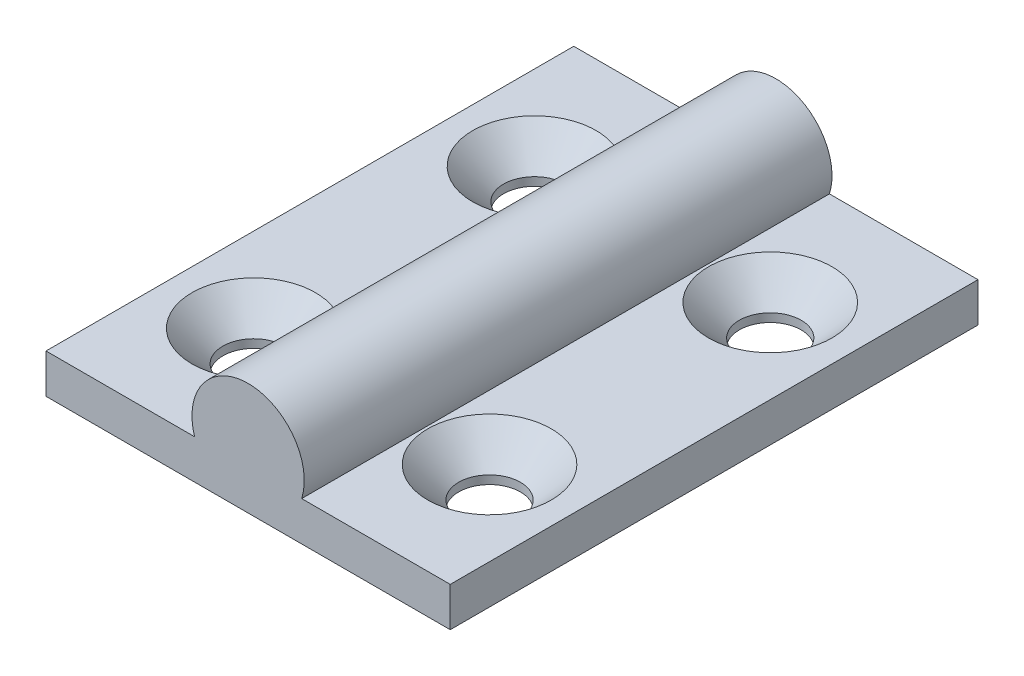
ISO-10303-21;
HEADER;
FILE_DESCRIPTION(('STEP AP214'),'2;1');
FILE_NAME('part.step','',(''),(''),'','','');
FILE_SCHEMA(('AUTOMOTIVE_DESIGN { 1 0 10303 214 1 1 1 1 }'));
ENDSEC;
DATA;
#1=APPLICATION_CONTEXT('core data for automotive mechanical design processes');
#2=APPLICATION_PROTOCOL_DEFINITION('international standard','automotive_design',2000,#1);
#3=PRODUCT_CONTEXT('',#1,'mechanical');
#4=PRODUCT('Part','Part','',(#3));
#5=PRODUCT_RELATED_PRODUCT_CATEGORY('part','',(#4));
#6=PRODUCT_DEFINITION_FORMATION('','',#4);
#7=PRODUCT_DEFINITION_CONTEXT('part definition',#1,'design');
#8=PRODUCT_DEFINITION('design','',#6,#7);
#9=PRODUCT_DEFINITION_SHAPE('','',#8);
#10=(LENGTH_UNIT() NAMED_UNIT(*) SI_UNIT(.MILLI.,.METRE.));
#11=(NAMED_UNIT(*) PLANE_ANGLE_UNIT() SI_UNIT($,.RADIAN.));
#12=(NAMED_UNIT(*) SI_UNIT($,.STERADIAN.) SOLID_ANGLE_UNIT());
#13=UNCERTAINTY_MEASURE_WITH_UNIT(LENGTH_MEASURE(1.E-05),#10,'distance_accuracy_value','');
#14=(GEOMETRIC_REPRESENTATION_CONTEXT(3) GLOBAL_UNCERTAINTY_ASSIGNED_CONTEXT((#13)) GLOBAL_UNIT_ASSIGNED_CONTEXT((#10,
#11,#12)) REPRESENTATION_CONTEXT('',''));
#15=CARTESIAN_POINT('',(0.,0.,0.));
#16=DIRECTION('',(0.,0.,1.));
#17=DIRECTION('',(1.,0.,0.));
#18=AXIS2_PLACEMENT_3D('',#15,#16,#17);
#19=CARTESIAN_POINT('',(0.,1.66533453693773E-13,23.5));
#20=DIRECTION('',(0.,0.,-1.));
#21=DIRECTION('',(-1.,0.,0.));
#22=AXIS2_PLACEMENT_3D('',#19,#20,#21);
#23=CYLINDRICAL_SURFACE('',#22,5.);
#24=DIRECTION('',(0.,0.,-1.));
#25=VECTOR('',#24,1.);
#26=CARTESIAN_POINT('',(4.76969600708477,-1.49999999999989,23.5000000000001));
#27=LINE('',#26,#25);
#28=CARTESIAN_POINT('',(4.76969600708477,-1.49999999999989,23.5000000000001));
#29=VERTEX_POINT('',#28);
#30=CARTESIAN_POINT('',(4.76969600708472,-1.5,-23.4999999999999));
#31=VERTEX_POINT('',#30);
#32=EDGE_CURVE('E121',#29,#31,#27,.T.);
#33=ORIENTED_EDGE('',*,*,#32,.T.);
#34=CARTESIAN_POINT('',(0.,0.,-23.5));
#35=DIRECTION('',(0.,0.,1.));
#36=DIRECTION('',(1.,0.,0.));
#37=AXIS2_PLACEMENT_3D('',#34,#35,#36);
#38=CIRCLE('',#37,5.);
#39=CARTESIAN_POINT('',(-4.76969600708477,-1.50000000000006,-23.5));
#40=VERTEX_POINT('',#39);
#41=EDGE_CURVE('E145',#31,#40,#38,.T.);
#42=ORIENTED_EDGE('',*,*,#41,.T.);
#43=DIRECTION('',(0.,0.,-1.));
#44=VECTOR('',#43,1.);
#45=CARTESIAN_POINT('',(-4.76969600708472,-1.49999999999989,23.5000000000001));
#46=LINE('',#45,#44);
#47=CARTESIAN_POINT('',(-4.76969600708472,-1.49999999999989,23.5000000000001));
#48=VERTEX_POINT('',#47);
#49=EDGE_CURVE('E11',#48,#40,#46,.T.);
#50=ORIENTED_EDGE('',*,*,#49,.F.);
#51=CARTESIAN_POINT('',(0.,1.66533453693773E-13,23.5));
#52=DIRECTION('',(0.,0.,1.));
#53=DIRECTION('',(1.,0.,0.));
#54=AXIS2_PLACEMENT_3D('',#51,#52,#53);
#55=CIRCLE('',#54,5.);
#56=EDGE_CURVE('E53',#29,#48,#55,.T.);
#57=ORIENTED_EDGE('',*,*,#56,.F.);
#58=EDGE_LOOP('',(#33,#42,#50,#57));
#59=FACE_BOUND('',#58,.T.);
#60=ADVANCED_FACE('F38',(#59),#23,.T.);
#61=CARTESIAN_POINT('',(0.,-4.99999999999984,23.5000000000004));
#62=DIRECTION('',(0.,-1.,0.));
#63=DIRECTION('',(1.,0.,0.));
#64=AXIS2_PLACEMENT_3D('',#61,#62,#63);
#65=PLANE('',#64);
#66=CARTESIAN_POINT('',(10.5,-5.,-12.4999999999995));
#67=DIRECTION('',(0.,1.,0.));
#68=DIRECTION('',(0.,0.,1.));
#69=AXIS2_PLACEMENT_3D('',#66,#67,#68);
#70=CIRCLE('',#69,2.75);
#71=CARTESIAN_POINT('',(10.5,-5.,-9.74999999999951));
#72=VERTEX_POINT('',#71);
#73=EDGE_CURVE('E272',#72,#72,#70,.T.);
#74=ORIENTED_EDGE('',*,*,#73,.T.);
#75=EDGE_LOOP('',(#74));
#76=FACE_BOUND('',#75,.T.);
#77=CARTESIAN_POINT('',(10.5,-5.,12.5000000000005));
#78=DIRECTION('',(0.,1.,0.));
#79=DIRECTION('',(0.,0.,1.));
#80=AXIS2_PLACEMENT_3D('',#77,#78,#79);
#81=CIRCLE('',#80,2.75);
#82=CARTESIAN_POINT('',(10.5,-5.,15.2500000000005));
#83=VERTEX_POINT('',#82);
#84=EDGE_CURVE('E161',#83,#83,#81,.T.);
#85=ORIENTED_EDGE('',*,*,#84,.T.);
#86=EDGE_LOOP('',(#85));
#87=FACE_BOUND('',#86,.T.);
#88=CARTESIAN_POINT('',(-10.5,-5.00000000000006,-12.4999999999996));
#89=DIRECTION('',(0.,1.,0.));
#90=DIRECTION('',(0.,0.,1.));
#91=AXIS2_PLACEMENT_3D('',#88,#89,#90);
#92=CIRCLE('',#91,2.75);
#93=CARTESIAN_POINT('',(-10.5,-5.00000000000006,-9.74999999999962));
#94=VERTEX_POINT('',#93);
#95=EDGE_CURVE('E127',#94,#94,#92,.T.);
#96=ORIENTED_EDGE('',*,*,#95,.T.);
#97=EDGE_LOOP('',(#96));
#98=FACE_BOUND('',#97,.T.);
#99=CARTESIAN_POINT('',(-10.5,-5.00000000000006,12.5000000000004));
#100=DIRECTION('',(0.,1.,0.));
#101=DIRECTION('',(0.,0.,1.));
#102=AXIS2_PLACEMENT_3D('',#99,#100,#101);
#103=CIRCLE('',#102,2.75);
#104=CARTESIAN_POINT('',(-10.5,-5.00000000000006,15.2500000000004));
#105=VERTEX_POINT('',#104);
#106=EDGE_CURVE('E136',#105,#105,#103,.T.);
#107=ORIENTED_EDGE('',*,*,#106,.T.);
#108=EDGE_LOOP('',(#107));
#109=FACE_BOUND('',#108,.T.);
#110=DIRECTION('',(-1.,0.,0.));
#111=VECTOR('',#110,1.);
#112=CARTESIAN_POINT('',(0.,-5.,-23.4999999999995));
#113=LINE('',#112,#111);
#114=CARTESIAN_POINT('',(18.,-5.,-23.5000000000002));
#115=VERTEX_POINT('',#114);
#116=CARTESIAN_POINT('',(-18.,-4.99999999999995,-23.4999999999995));
#117=VERTEX_POINT('',#116);
#118=EDGE_CURVE('E114',#115,#117,#113,.T.);
#119=ORIENTED_EDGE('',*,*,#118,.F.);
#120=DIRECTION('',(0.,0.,-1.));
#121=VECTOR('',#120,1.);
#122=CARTESIAN_POINT('',(18.,-5.,23.4999999999999));
#123=LINE('',#122,#121);
#124=CARTESIAN_POINT('',(18.,-5.,23.4999999999999));
#125=VERTEX_POINT('',#124);
#126=EDGE_CURVE('E107',#125,#115,#123,.T.);
#127=ORIENTED_EDGE('',*,*,#126,.F.);
#128=DIRECTION('',(-1.,0.,0.));
#129=VECTOR('',#128,1.);
#130=CARTESIAN_POINT('',(0.,-4.99999999999984,23.5000000000004));
#131=LINE('',#130,#129);
#132=CARTESIAN_POINT('',(-18.,-4.99999999999989,23.5000000000005));
#133=VERTEX_POINT('',#132);
#134=EDGE_CURVE('E95',#125,#133,#131,.T.);
#135=ORIENTED_EDGE('',*,*,#134,.T.);
#136=DIRECTION('',(0.,0.,-1.));
#137=VECTOR('',#136,1.);
#138=CARTESIAN_POINT('',(-18.,-4.99999999999989,23.5000000000005));
#139=LINE('',#138,#137);
#140=EDGE_CURVE('E62',#133,#117,#139,.T.);
#141=ORIENTED_EDGE('',*,*,#140,.T.);
#142=EDGE_LOOP('',(#119,#127,#135,#141));
#143=FACE_BOUND('',#142,.T.);
#144=ADVANCED_FACE('F40',(#76,#87,#98,#109,#143),#65,.T.);
#145=CARTESIAN_POINT('',(0.,-1.49999999999983,23.5000000000001));
#146=DIRECTION('',(0.,1.,0.));
#147=DIRECTION('',(0.,0.,1.));
#148=AXIS2_PLACEMENT_3D('',#145,#146,#147);
#149=PLANE('',#148);
#150=CARTESIAN_POINT('',(-10.5,-1.50000000000006,-12.4999999999996));
#151=DIRECTION('',(0.,1.,0.));
#152=DIRECTION('',(0.,0.,1.));
#153=AXIS2_PLACEMENT_3D('',#150,#151,#152);
#154=CIRCLE('',#153,5.5);
#155=CARTESIAN_POINT('',(-10.5,-1.50000000000006,-6.99999999999962));
#156=VERTEX_POINT('',#155);
#157=EDGE_CURVE('E116',#156,#156,#154,.T.);
#158=ORIENTED_EDGE('',*,*,#157,.F.);
#159=EDGE_LOOP('',(#158));
#160=FACE_BOUND('',#159,.T.);
#161=CARTESIAN_POINT('',(-10.5000000000001,-1.50000000000006,12.5000000000004));
#162=DIRECTION('',(0.,1.,0.));
#163=DIRECTION('',(0.,0.,1.));
#164=AXIS2_PLACEMENT_3D('',#161,#162,#163);
#165=CIRCLE('',#164,5.5);
#166=CARTESIAN_POINT('',(-10.5000000000001,-1.50000000000006,18.0000000000004));
#167=VERTEX_POINT('',#166);
#168=EDGE_CURVE('E130',#167,#167,#165,.T.);
#169=ORIENTED_EDGE('',*,*,#168,.F.);
#170=EDGE_LOOP('',(#169));
#171=FACE_BOUND('',#170,.T.);
#172=DIRECTION('',(1.,0.,0.));
#173=VECTOR('',#172,1.);
#174=CARTESIAN_POINT('',(0.,-1.5,-23.4999999999999));
#175=LINE('',#174,#173);
#176=CARTESIAN_POINT('',(-18.,-1.49999999999995,-23.4999999999999));
#177=VERTEX_POINT('',#176);
#178=EDGE_CURVE('E147',#177,#40,#175,.T.);
#179=ORIENTED_EDGE('',*,*,#178,.F.);
#180=DIRECTION('',(0.,0.,-1.));
#181=VECTOR('',#180,1.);
#182=CARTESIAN_POINT('',(-18.,-1.49999999999989,23.5000000000002));
#183=LINE('',#182,#181);
#184=CARTESIAN_POINT('',(-18.,-1.49999999999989,23.5000000000002));
#185=VERTEX_POINT('',#184);
#186=EDGE_CURVE('E46',#185,#177,#183,.T.);
#187=ORIENTED_EDGE('',*,*,#186,.F.);
#188=DIRECTION('',(1.,0.,0.));
#189=VECTOR('',#188,1.);
#190=CARTESIAN_POINT('',(0.,-1.49999999999983,23.5000000000001));
#191=LINE('',#190,#189);
#192=EDGE_CURVE('E140',#185,#48,#191,.T.);
#193=ORIENTED_EDGE('',*,*,#192,.T.);
#194=ORIENTED_EDGE('',*,*,#49,.T.);
#195=EDGE_LOOP('',(#179,#187,#193,#194));
#196=FACE_BOUND('',#195,.T.);
#197=ADVANCED_FACE('F155',(#160,#171,#196),#149,.T.);
#198=CARTESIAN_POINT('',(-18.,1.11022302462516E-13,23.5000000000001));
#199=DIRECTION('',(-1.,0.,0.));
#200=DIRECTION('',(0.,0.,1.));
#201=AXIS2_PLACEMENT_3D('',#198,#199,#200);
#202=PLANE('',#201);
#203=DIRECTION('',(0.,1.,0.));
#204=VECTOR('',#203,1.);
#205=CARTESIAN_POINT('',(-18.,0.,-23.5));
#206=LINE('',#205,#204);
#207=EDGE_CURVE('E102',#117,#177,#206,.T.);
#208=ORIENTED_EDGE('',*,*,#207,.F.);
#209=ORIENTED_EDGE('',*,*,#140,.F.);
#210=DIRECTION('',(0.,1.,0.));
#211=VECTOR('',#210,1.);
#212=CARTESIAN_POINT('',(-18.,1.11022302462516E-13,23.5000000000001));
#213=LINE('',#212,#211);
#214=EDGE_CURVE('E100',#133,#185,#213,.T.);
#215=ORIENTED_EDGE('',*,*,#214,.T.);
#216=ORIENTED_EDGE('',*,*,#186,.T.);
#217=EDGE_LOOP('',(#208,#209,#215,#216));
#218=FACE_BOUND('',#217,.T.);
#219=ADVANCED_FACE('F153',(#218),#202,.T.);
#220=CARTESIAN_POINT('',(0.,1.66533453693773E-13,23.5));
#221=DIRECTION('',(0.,0.,1.));
#222=DIRECTION('',(1.,0.,0.));
#223=AXIS2_PLACEMENT_3D('',#220,#221,#222);
#224=PLANE('',#223);
#225=ORIENTED_EDGE('',*,*,#134,.F.);
#226=DIRECTION('',(0.,1.,0.));
#227=VECTOR('',#226,1.);
#228=CARTESIAN_POINT('',(18.0000000000001,0.,23.5000000000003));
#229=LINE('',#228,#227);
#230=CARTESIAN_POINT('',(18.,-1.5,23.4999999999999));
#231=VERTEX_POINT('',#230);
#232=EDGE_CURVE('E98',#125,#231,#229,.T.);
#233=ORIENTED_EDGE('',*,*,#232,.T.);
#234=DIRECTION('',(-1.,0.,0.));
#235=VECTOR('',#234,1.);
#236=CARTESIAN_POINT('',(0.,-1.49999999999983,23.5000000000001));
#237=LINE('',#236,#235);
#238=EDGE_CURVE('E111',#231,#29,#237,.T.);
#239=ORIENTED_EDGE('',*,*,#238,.T.);
#240=ORIENTED_EDGE('',*,*,#56,.T.);
#241=ORIENTED_EDGE('',*,*,#192,.F.);
#242=ORIENTED_EDGE('',*,*,#214,.F.);
#243=EDGE_LOOP('',(#225,#233,#239,#240,#241,#242));
#244=FACE_BOUND('',#243,.T.);
#245=ADVANCED_FACE('F97',(#244),#224,.T.);
#246=CARTESIAN_POINT('',(0.,0.,-23.5));
#247=DIRECTION('',(0.,0.,1.));
#248=DIRECTION('',(1.,0.,0.));
#249=AXIS2_PLACEMENT_3D('',#246,#247,#248);
#250=PLANE('',#249);
#251=ORIENTED_EDGE('',*,*,#178,.T.);
#252=ORIENTED_EDGE('',*,*,#41,.F.);
#253=DIRECTION('',(-1.,0.,0.));
#254=VECTOR('',#253,1.);
#255=CARTESIAN_POINT('',(0.,-1.5,-23.4999999999999));
#256=LINE('',#255,#254);
#257=CARTESIAN_POINT('',(18.,-1.5,-23.5000000000001));
#258=VERTEX_POINT('',#257);
#259=EDGE_CURVE('E112',#258,#31,#256,.T.);
#260=ORIENTED_EDGE('',*,*,#259,.F.);
#261=DIRECTION('',(0.,1.,0.));
#262=VECTOR('',#261,1.);
#263=CARTESIAN_POINT('',(18.,0.,-23.4999999999997));
#264=LINE('',#263,#262);
#265=EDGE_CURVE('E159',#115,#258,#264,.T.);
#266=ORIENTED_EDGE('',*,*,#265,.F.);
#267=ORIENTED_EDGE('',*,*,#118,.T.);
#268=ORIENTED_EDGE('',*,*,#207,.T.);
#269=EDGE_LOOP('',(#251,#252,#260,#266,#267,#268));
#270=FACE_BOUND('',#269,.T.);
#271=ADVANCED_FACE('F157',(#270),#250,.F.);
#272=CARTESIAN_POINT('',(-10.5000000000001,-1.50000000000006,12.5000000000004));
#273=DIRECTION('',(0.,1.,0.));
#274=DIRECTION('',(0.,0.,1.));
#275=AXIS2_PLACEMENT_3D('',#272,#273,#274);
#276=CYLINDRICAL_SURFACE('',#275,2.75);
#277=ORIENTED_EDGE('',*,*,#106,.F.);
#278=EDGE_LOOP('',(#277));
#279=FACE_BOUND('',#278,.T.);
#280=CARTESIAN_POINT('',(-10.5000000000001,-4.25000000000003,12.5000000000004));
#281=DIRECTION('',(0.,1.,0.));
#282=DIRECTION('',(0.,0.,1.));
#283=AXIS2_PLACEMENT_3D('',#280,#281,#282);
#284=CIRCLE('',#283,2.75);
#285=CARTESIAN_POINT('',(-10.5000000000001,-4.25000000000003,15.2500000000004));
#286=VERTEX_POINT('',#285);
#287=EDGE_CURVE('E133',#286,#286,#284,.T.);
#288=ORIENTED_EDGE('',*,*,#287,.T.);
#289=EDGE_LOOP('',(#288));
#290=FACE_BOUND('',#289,.T.);
#291=ADVANCED_FACE('F199',(#279,#290),#276,.F.);
#292=CARTESIAN_POINT('',(-10.5000000000001,-1.50000000000006,12.5000000000004));
#293=DIRECTION('',(0.,1.,0.));
#294=DIRECTION('',(0.,0.,1.));
#295=AXIS2_PLACEMENT_3D('',#292,#293,#294);
#296=CONICAL_SURFACE('',#295,5.5,0.78539816339745);
#297=ORIENTED_EDGE('',*,*,#287,.F.);
#298=EDGE_LOOP('',(#297));
#299=FACE_BOUND('',#298,.T.);
#300=ORIENTED_EDGE('',*,*,#168,.T.);
#301=EDGE_LOOP('',(#300));
#302=FACE_BOUND('',#301,.T.);
#303=ADVANCED_FACE('F204',(#299,#302),#296,.F.);
#304=CARTESIAN_POINT('',(-10.5,-1.50000000000006,-12.4999999999996));
#305=DIRECTION('',(0.,1.,0.));
#306=DIRECTION('',(0.,0.,1.));
#307=AXIS2_PLACEMENT_3D('',#304,#305,#306);
#308=CYLINDRICAL_SURFACE('',#307,2.75);
#309=ORIENTED_EDGE('',*,*,#95,.F.);
#310=EDGE_LOOP('',(#309));
#311=FACE_BOUND('',#310,.T.);
#312=CARTESIAN_POINT('',(-10.5,-4.25000000000003,-12.4999999999996));
#313=DIRECTION('',(0.,1.,0.));
#314=DIRECTION('',(0.,0.,1.));
#315=AXIS2_PLACEMENT_3D('',#312,#313,#314);
#316=CIRCLE('',#315,2.75);
#317=CARTESIAN_POINT('',(-10.5,-4.25000000000003,-9.74999999999962));
#318=VERTEX_POINT('',#317);
#319=EDGE_CURVE('E119',#318,#318,#316,.T.);
#320=ORIENTED_EDGE('',*,*,#319,.T.);
#321=EDGE_LOOP('',(#320));
#322=FACE_BOUND('',#321,.T.);
#323=ADVANCED_FACE('F208',(#311,#322),#308,.F.);
#324=CARTESIAN_POINT('',(-10.5,-1.50000000000006,-12.4999999999996));
#325=DIRECTION('',(0.,1.,0.));
#326=DIRECTION('',(0.,0.,1.));
#327=AXIS2_PLACEMENT_3D('',#324,#325,#326);
#328=CONICAL_SURFACE('',#327,5.5,0.78539816339745);
#329=ORIENTED_EDGE('',*,*,#319,.F.);
#330=EDGE_LOOP('',(#329));
#331=FACE_BOUND('',#330,.T.);
#332=ORIENTED_EDGE('',*,*,#157,.T.);
#333=EDGE_LOOP('',(#332));
#334=FACE_BOUND('',#333,.T.);
#335=ADVANCED_FACE('F182',(#331,#334),#328,.F.);
#336=CARTESIAN_POINT('',(18.0000000000001,0.,23.5000000000003));
#337=DIRECTION('',(-1.,0.,0.));
#338=DIRECTION('',(0.,0.,1.));
#339=AXIS2_PLACEMENT_3D('',#336,#337,#338);
#340=PLANE('',#339);
#341=ORIENTED_EDGE('',*,*,#265,.T.);
#342=DIRECTION('',(0.,0.,-1.));
#343=VECTOR('',#342,1.);
#344=CARTESIAN_POINT('',(18.,-1.5,23.4999999999999));
#345=LINE('',#344,#343);
#346=EDGE_CURVE('E109',#231,#258,#345,.T.);
#347=ORIENTED_EDGE('',*,*,#346,.F.);
#348=ORIENTED_EDGE('',*,*,#232,.F.);
#349=ORIENTED_EDGE('',*,*,#126,.T.);
#350=EDGE_LOOP('',(#341,#347,#348,#349));
#351=FACE_BOUND('',#350,.T.);
#352=ADVANCED_FACE('F106',(#351),#340,.F.);
#353=CARTESIAN_POINT('',(0.,-1.49999999999983,23.5000000000001));
#354=DIRECTION('',(0.,-1.,0.));
#355=DIRECTION('',(0.,0.,-1.));
#356=AXIS2_PLACEMENT_3D('',#353,#354,#355);
#357=PLANE('',#356);
#358=CARTESIAN_POINT('',(10.5,-1.5,-12.4999999999998));
#359=DIRECTION('',(0.,1.,0.));
#360=DIRECTION('',(0.,0.,1.));
#361=AXIS2_PLACEMENT_3D('',#358,#359,#360);
#362=CIRCLE('',#361,5.5);
#363=CARTESIAN_POINT('',(10.5,-1.5,-6.99999999999984));
#364=VERTEX_POINT('',#363);
#365=EDGE_CURVE('E270',#364,#364,#362,.T.);
#366=ORIENTED_EDGE('',*,*,#365,.F.);
#367=EDGE_LOOP('',(#366));
#368=FACE_BOUND('',#367,.T.);
#369=CARTESIAN_POINT('',(10.5,-1.5,12.5000000000002));
#370=DIRECTION('',(0.,1.,0.));
#371=DIRECTION('',(0.,0.,1.));
#372=AXIS2_PLACEMENT_3D('',#369,#370,#371);
#373=CIRCLE('',#372,5.5);
#374=CARTESIAN_POINT('',(10.5,-1.5,18.0000000000002));
#375=VERTEX_POINT('',#374);
#376=EDGE_CURVE('E277',#375,#375,#373,.T.);
#377=ORIENTED_EDGE('',*,*,#376,.F.);
#378=EDGE_LOOP('',(#377));
#379=FACE_BOUND('',#378,.T.);
#380=ORIENTED_EDGE('',*,*,#259,.T.);
#381=ORIENTED_EDGE('',*,*,#32,.F.);
#382=ORIENTED_EDGE('',*,*,#238,.F.);
#383=ORIENTED_EDGE('',*,*,#346,.T.);
#384=EDGE_LOOP('',(#380,#381,#382,#383));
#385=FACE_BOUND('',#384,.T.);
#386=ADVANCED_FACE('F170',(#368,#379,#385),#357,.F.);
#387=CARTESIAN_POINT('',(10.5,-1.5,12.5000000000002));
#388=DIRECTION('',(0.,1.,0.));
#389=DIRECTION('',(0.,0.,1.));
#390=AXIS2_PLACEMENT_3D('',#387,#388,#389);
#391=CYLINDRICAL_SURFACE('',#390,2.75);
#392=ORIENTED_EDGE('',*,*,#84,.F.);
#393=EDGE_LOOP('',(#392));
#394=FACE_BOUND('',#393,.T.);
#395=CARTESIAN_POINT('',(10.5,-4.25000000000003,12.5000000000005));
#396=DIRECTION('',(0.,1.,0.));
#397=DIRECTION('',(0.,0.,1.));
#398=AXIS2_PLACEMENT_3D('',#395,#396,#397);
#399=CIRCLE('',#398,2.75);
#400=CARTESIAN_POINT('',(10.5,-4.25000000000003,15.2500000000005));
#401=VERTEX_POINT('',#400);
#402=EDGE_CURVE('E165',#401,#401,#399,.T.);
#403=ORIENTED_EDGE('',*,*,#402,.T.);
#404=EDGE_LOOP('',(#403));
#405=FACE_BOUND('',#404,.T.);
#406=ADVANCED_FACE('F172',(#394,#405),#391,.F.);
#407=CARTESIAN_POINT('',(10.5,-1.5,12.5000000000002));
#408=DIRECTION('',(0.,1.,0.));
#409=DIRECTION('',(0.,0.,1.));
#410=AXIS2_PLACEMENT_3D('',#407,#408,#409);
#411=CONICAL_SURFACE('',#410,5.5,0.78539816339745);
#412=ORIENTED_EDGE('',*,*,#402,.F.);
#413=EDGE_LOOP('',(#412));
#414=FACE_BOUND('',#413,.T.);
#415=ORIENTED_EDGE('',*,*,#376,.T.);
#416=EDGE_LOOP('',(#415));
#417=FACE_BOUND('',#416,.T.);
#418=ADVANCED_FACE('F179',(#414,#417),#411,.F.);
#419=CARTESIAN_POINT('',(10.5,-1.5,-12.4999999999998));
#420=DIRECTION('',(0.,1.,0.));
#421=DIRECTION('',(0.,0.,1.));
#422=AXIS2_PLACEMENT_3D('',#419,#420,#421);
#423=CYLINDRICAL_SURFACE('',#422,2.75);
#424=ORIENTED_EDGE('',*,*,#73,.F.);
#425=EDGE_LOOP('',(#424));
#426=FACE_BOUND('',#425,.T.);
#427=CARTESIAN_POINT('',(10.5,-4.25000000000003,-12.4999999999995));
#428=DIRECTION('',(0.,1.,0.));
#429=DIRECTION('',(0.,0.,1.));
#430=AXIS2_PLACEMENT_3D('',#427,#428,#429);
#431=CIRCLE('',#430,2.75);
#432=CARTESIAN_POINT('',(10.5,-4.25000000000003,-9.74999999999951));
#433=VERTEX_POINT('',#432);
#434=EDGE_CURVE('E268',#433,#433,#431,.T.);
#435=ORIENTED_EDGE('',*,*,#434,.T.);
#436=EDGE_LOOP('',(#435));
#437=FACE_BOUND('',#436,.T.);
#438=ADVANCED_FACE('F247',(#426,#437),#423,.F.);
#439=CARTESIAN_POINT('',(10.5,-1.5,-12.4999999999998));
#440=DIRECTION('',(0.,1.,0.));
#441=DIRECTION('',(0.,0.,1.));
#442=AXIS2_PLACEMENT_3D('',#439,#440,#441);
#443=CONICAL_SURFACE('',#442,5.5,0.78539816339745);
#444=ORIENTED_EDGE('',*,*,#434,.F.);
#445=EDGE_LOOP('',(#444));
#446=FACE_BOUND('',#445,.T.);
#447=ORIENTED_EDGE('',*,*,#365,.T.);
#448=EDGE_LOOP('',(#447));
#449=FACE_BOUND('',#448,.T.);
#450=ADVANCED_FACE('F255',(#446,#449),#443,.F.);
#451=CLOSED_SHELL('',(#60,#144,#197,#219,#245,#271,#291,#303,#323,#335,#352,#386,#406,#418,#438,#450));
#452=MANIFOLD_SOLID_BREP('B2',#451);
#453=ADVANCED_BREP_SHAPE_REPRESENTATION('',(#18,#452),#14);
#454=SHAPE_DEFINITION_REPRESENTATION(#9,#453);
ENDSEC;
END-ISO-10303-21;
